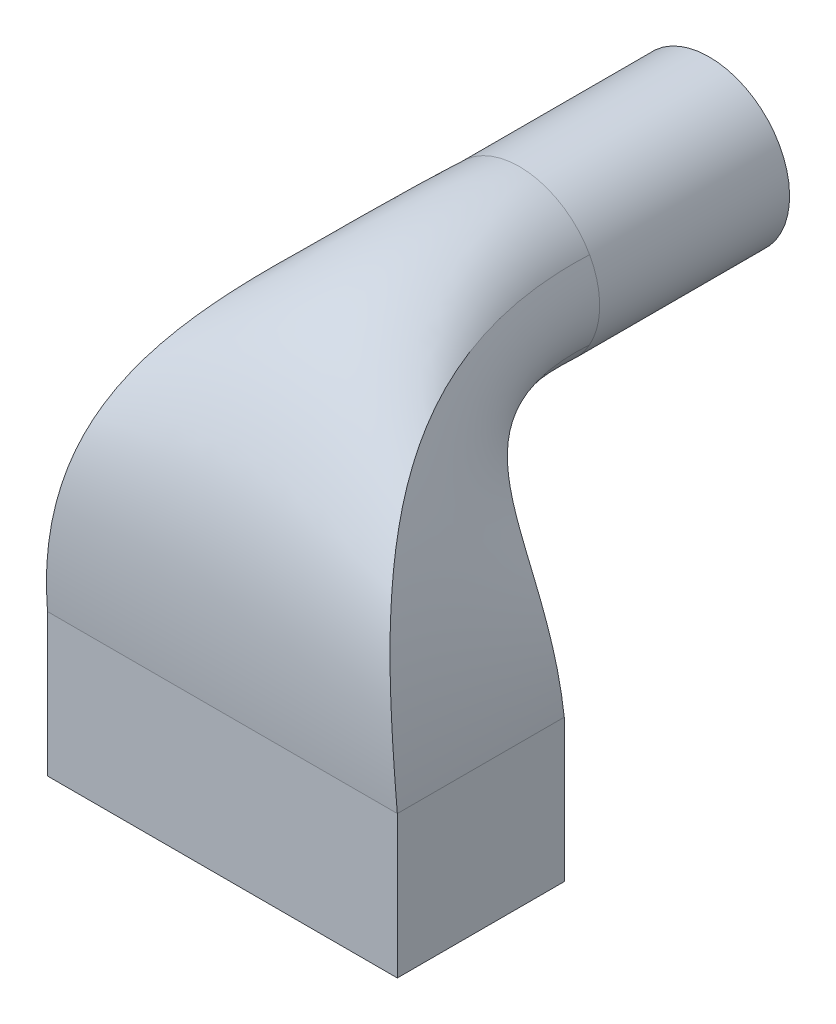
ISO-10303-21;
HEADER;
FILE_DESCRIPTION(('STEP AP214'),'2;1');
FILE_NAME('part.step','',(''),(''),'','','');
FILE_SCHEMA(('AUTOMOTIVE_DESIGN { 1 0 10303 214 1 1 1 1 }'));
ENDSEC;
DATA;
#1=APPLICATION_CONTEXT('core data for automotive mechanical design processes');
#2=APPLICATION_PROTOCOL_DEFINITION('international standard','automotive_design',2000,#1);
#3=PRODUCT_CONTEXT('',#1,'mechanical');
#4=PRODUCT('Part','Part','',(#3));
#5=PRODUCT_RELATED_PRODUCT_CATEGORY('part','',(#4));
#6=PRODUCT_DEFINITION_FORMATION('','',#4);
#7=PRODUCT_DEFINITION_CONTEXT('part definition',#1,'design');
#8=PRODUCT_DEFINITION('design','',#6,#7);
#9=PRODUCT_DEFINITION_SHAPE('','',#8);
#10=(LENGTH_UNIT() NAMED_UNIT(*) SI_UNIT(.MILLI.,.METRE.));
#11=(NAMED_UNIT(*) PLANE_ANGLE_UNIT() SI_UNIT($,.RADIAN.));
#12=(NAMED_UNIT(*) SI_UNIT($,.STERADIAN.) SOLID_ANGLE_UNIT());
#13=UNCERTAINTY_MEASURE_WITH_UNIT(LENGTH_MEASURE(1.E-05),#10,'distance_accuracy_value','');
#14=(GEOMETRIC_REPRESENTATION_CONTEXT(3) GLOBAL_UNCERTAINTY_ASSIGNED_CONTEXT((#13)) GLOBAL_UNIT_ASSIGNED_CONTEXT((#10,
#11,#12)) REPRESENTATION_CONTEXT('',''));
#15=CARTESIAN_POINT('',(0.,0.,0.));
#16=DIRECTION('',(0.,0.,1.));
#17=DIRECTION('',(1.,0.,0.));
#18=AXIS2_PLACEMENT_3D('',#15,#16,#17);
#19=CARTESIAN_POINT('',(0.,0.,0.));
#20=DIRECTION('',(0.,-1.,0.));
#21=DIRECTION('',(0.,0.,-1.));
#22=AXIS2_PLACEMENT_3D('',#19,#20,#21);
#23=PLANE('',#22);
#24=DIRECTION('',(0.,0.,-1.));
#25=VECTOR('',#24,1.);
#26=CARTESIAN_POINT('',(3.68476653354024,0.,1.75820796518656));
#27=LINE('',#26,#25);
#28=CARTESIAN_POINT('',(3.68476653354024,0.,1.75820796518656));
#29=VERTEX_POINT('',#28);
#30=CARTESIAN_POINT('',(3.68476653354023,0.,-1.75820796518656));
#31=VERTEX_POINT('',#30);
#32=EDGE_CURVE('E328',#29,#31,#27,.T.);
#33=ORIENTED_EDGE('',*,*,#32,.F.);
#34=DIRECTION('',(1.,0.,0.));
#35=VECTOR('',#34,1.);
#36=CARTESIAN_POINT('',(-3.68476653354024,0.,1.75820796518656));
#37=LINE('',#36,#35);
#38=CARTESIAN_POINT('',(-3.68476653354024,0.,1.75820796518656));
#39=VERTEX_POINT('',#38);
#40=EDGE_CURVE('E316',#39,#29,#37,.T.);
#41=ORIENTED_EDGE('',*,*,#40,.F.);
#42=DIRECTION('',(0.,0.,1.));
#43=VECTOR('',#42,1.);
#44=CARTESIAN_POINT('',(-3.68476653354024,0.,1.75820796518656));
#45=LINE('',#44,#43);
#46=CARTESIAN_POINT('',(-3.68476653354024,0.,-1.75820796518656));
#47=VERTEX_POINT('',#46);
#48=EDGE_CURVE('E308',#47,#39,#45,.T.);
#49=ORIENTED_EDGE('',*,*,#48,.F.);
#50=DIRECTION('',(-1.,0.,0.));
#51=VECTOR('',#50,1.);
#52=CARTESIAN_POINT('',(-3.68476653354024,0.,-1.75820796518656));
#53=LINE('',#52,#51);
#54=EDGE_CURVE('E317',#31,#47,#53,.T.);
#55=ORIENTED_EDGE('',*,*,#54,.F.);
#56=EDGE_LOOP('',(#33,#41,#49,#55));
#57=FACE_BOUND('',#56,.T.);
#58=DIRECTION('',(1.,0.,0.));
#59=VECTOR('',#58,1.);
#60=CARTESIAN_POINT('',(-3.,0.,1.25));
#61=LINE('',#60,#59);
#62=CARTESIAN_POINT('',(-3.,0.,1.25));
#63=VERTEX_POINT('',#62);
#64=CARTESIAN_POINT('',(3.,0.,1.25));
#65=VERTEX_POINT('',#64);
#66=EDGE_CURVE('E508',#63,#65,#61,.T.);
#67=ORIENTED_EDGE('',*,*,#66,.T.);
#68=DIRECTION('',(0.,0.,-1.));
#69=VECTOR('',#68,1.);
#70=CARTESIAN_POINT('',(3.,0.,1.25));
#71=LINE('',#70,#69);
#72=CARTESIAN_POINT('',(3.,0.,-1.25));
#73=VERTEX_POINT('',#72);
#74=EDGE_CURVE('E238',#65,#73,#71,.T.);
#75=ORIENTED_EDGE('',*,*,#74,.T.);
#76=DIRECTION('',(-1.,0.,0.));
#77=VECTOR('',#76,1.);
#78=CARTESIAN_POINT('',(-3.,0.,-1.25));
#79=LINE('',#78,#77);
#80=CARTESIAN_POINT('',(-3.,0.,-1.25));
#81=VERTEX_POINT('',#80);
#82=EDGE_CURVE('E514',#73,#81,#79,.T.);
#83=ORIENTED_EDGE('',*,*,#82,.T.);
#84=DIRECTION('',(0.,0.,1.));
#85=VECTOR('',#84,1.);
#86=CARTESIAN_POINT('',(-3.,0.,1.25));
#87=LINE('',#86,#85);
#88=EDGE_CURVE('E511',#81,#63,#87,.T.);
#89=ORIENTED_EDGE('',*,*,#88,.T.);
#90=EDGE_LOOP('',(#67,#75,#83,#89));
#91=FACE_BOUND('',#90,.T.);
#92=ADVANCED_FACE('F218',(#57,#91),#23,.T.);
#93=CARTESIAN_POINT('',(3.68476653354024,2.,1.75820796518656));
#94=DIRECTION('',(-1.,0.,0.));
#95=DIRECTION('',(0.,0.,1.));
#96=AXIS2_PLACEMENT_3D('',#93,#94,#95);
#97=PLANE('',#96);
#98=ORIENTED_EDGE('',*,*,#32,.T.);
#99=DIRECTION('',(0.,-1.,0.));
#100=VECTOR('',#99,1.);
#101=CARTESIAN_POINT('',(3.68476653354023,2.,-1.75820796518656));
#102=LINE('',#101,#100);
#103=CARTESIAN_POINT('',(3.68476653354023,3.,-1.75820796518656));
#104=VERTEX_POINT('',#103);
#105=EDGE_CURVE('E13',#104,#31,#102,.T.);
#106=ORIENTED_EDGE('',*,*,#105,.F.);
#107=DIRECTION('',(0.,0.,1.));
#108=VECTOR('',#107,1.);
#109=CARTESIAN_POINT('',(3.68476653354024,3.,1.75820796518656));
#110=LINE('',#109,#108);
#111=CARTESIAN_POINT('',(3.68476653354023,3.,1.75820796518656));
#112=VERTEX_POINT('',#111);
#113=EDGE_CURVE('E259',#112,#104,#110,.F.);
#114=ORIENTED_EDGE('',*,*,#113,.F.);
#115=DIRECTION('',(0.,-1.,0.));
#116=VECTOR('',#115,1.);
#117=CARTESIAN_POINT('',(3.68476653354024,2.,1.75820796518656));
#118=LINE('',#117,#116);
#119=EDGE_CURVE('E323',#112,#29,#118,.T.);
#120=ORIENTED_EDGE('',*,*,#119,.T.);
#121=EDGE_LOOP('',(#98,#106,#114,#120));
#122=FACE_BOUND('',#121,.T.);
#123=ADVANCED_FACE('F220',(#122),#97,.F.);
#124=CARTESIAN_POINT('',(-3.68476653354024,2.,-1.75820796518656));
#125=DIRECTION('',(0.,0.,1.));
#126=DIRECTION('',(1.,0.,0.));
#127=AXIS2_PLACEMENT_3D('',#124,#125,#126);
#128=PLANE('',#127);
#129=ORIENTED_EDGE('',*,*,#54,.T.);
#130=DIRECTION('',(0.,-1.,0.));
#131=VECTOR('',#130,1.);
#132=CARTESIAN_POINT('',(-3.68476653354024,2.,-1.75820796518656));
#133=LINE('',#132,#131);
#134=CARTESIAN_POINT('',(-3.68476653354024,3.,-1.75820796518656));
#135=VERTEX_POINT('',#134);
#136=EDGE_CURVE('E229',#135,#47,#133,.T.);
#137=ORIENTED_EDGE('',*,*,#136,.F.);
#138=DIRECTION('',(1.,0.,0.));
#139=VECTOR('',#138,1.);
#140=CARTESIAN_POINT('',(-3.68476653354024,3.,-1.75820796518656));
#141=LINE('',#140,#139);
#142=EDGE_CURVE('E338',#104,#135,#141,.F.);
#143=ORIENTED_EDGE('',*,*,#142,.F.);
#144=ORIENTED_EDGE('',*,*,#105,.T.);
#145=EDGE_LOOP('',(#129,#137,#143,#144));
#146=FACE_BOUND('',#145,.T.);
#147=ADVANCED_FACE('F496',(#146),#128,.F.);
#148=CARTESIAN_POINT('',(-3.68476653354024,2.,1.75820796518656));
#149=DIRECTION('',(1.,0.,0.));
#150=DIRECTION('',(0.,0.,-1.));
#151=AXIS2_PLACEMENT_3D('',#148,#149,#150);
#152=PLANE('',#151);
#153=ORIENTED_EDGE('',*,*,#48,.T.);
#154=DIRECTION('',(0.,-1.,0.));
#155=VECTOR('',#154,1.);
#156=CARTESIAN_POINT('',(-3.68476653354024,2.,1.75820796518656));
#157=LINE('',#156,#155);
#158=CARTESIAN_POINT('',(-3.68476653354024,3.,1.75820796518656));
#159=VERTEX_POINT('',#158);
#160=EDGE_CURVE('E312',#159,#39,#157,.T.);
#161=ORIENTED_EDGE('',*,*,#160,.F.);
#162=DIRECTION('',(0.,0.,-1.));
#163=VECTOR('',#162,1.);
#164=CARTESIAN_POINT('',(-3.68476653354024,3.,1.75820796518656));
#165=LINE('',#164,#163);
#166=EDGE_CURVE('E335',#135,#159,#165,.F.);
#167=ORIENTED_EDGE('',*,*,#166,.F.);
#168=ORIENTED_EDGE('',*,*,#136,.T.);
#169=EDGE_LOOP('',(#153,#161,#167,#168));
#170=FACE_BOUND('',#169,.T.);
#171=ADVANCED_FACE('F310',(#170),#152,.F.);
#172=CARTESIAN_POINT('',(-3.68476653354024,2.,1.75820796518656));
#173=DIRECTION('',(0.,0.,-1.));
#174=DIRECTION('',(-1.,0.,0.));
#175=AXIS2_PLACEMENT_3D('',#172,#173,#174);
#176=PLANE('',#175);
#177=ORIENTED_EDGE('',*,*,#40,.T.);
#178=ORIENTED_EDGE('',*,*,#119,.F.);
#179=DIRECTION('',(-1.,0.,0.));
#180=VECTOR('',#179,1.);
#181=CARTESIAN_POINT('',(-3.68476653354024,3.,1.75820796518656));
#182=LINE('',#181,#180);
#183=EDGE_CURVE('E322',#159,#112,#182,.F.);
#184=ORIENTED_EDGE('',*,*,#183,.F.);
#185=ORIENTED_EDGE('',*,*,#160,.T.);
#186=EDGE_LOOP('',(#177,#178,#184,#185));
#187=FACE_BOUND('',#186,.T.);
#188=ADVANCED_FACE('F320',(#187),#176,.F.);
#189=CARTESIAN_POINT('',(3.,2.,1.25));
#190=DIRECTION('',(-1.,0.,0.));
#191=DIRECTION('',(0.,0.,1.));
#192=AXIS2_PLACEMENT_3D('',#189,#190,#191);
#193=PLANE('',#192);
#194=ORIENTED_EDGE('',*,*,#74,.F.);
#195=DIRECTION('',(0.,-1.,0.));
#196=VECTOR('',#195,1.);
#197=CARTESIAN_POINT('',(3.,2.,1.25));
#198=LINE('',#197,#196);
#199=CARTESIAN_POINT('',(3.,2.,1.25));
#200=VERTEX_POINT('',#199);
#201=EDGE_CURVE('E505',#200,#65,#198,.T.);
#202=ORIENTED_EDGE('',*,*,#201,.F.);
#203=DIRECTION('',(0.,0.,-1.));
#204=VECTOR('',#203,1.);
#205=CARTESIAN_POINT('',(3.,2.,1.25));
#206=LINE('',#205,#204);
#207=CARTESIAN_POINT('',(3.,2.,-1.25));
#208=VERTEX_POINT('',#207);
#209=EDGE_CURVE('E354',#200,#208,#206,.T.);
#210=ORIENTED_EDGE('',*,*,#209,.T.);
#211=DIRECTION('',(0.,-1.,0.));
#212=VECTOR('',#211,1.);
#213=CARTESIAN_POINT('',(3.,2.,-1.25));
#214=LINE('',#213,#212);
#215=EDGE_CURVE('E497',#208,#73,#214,.T.);
#216=ORIENTED_EDGE('',*,*,#215,.T.);
#217=EDGE_LOOP('',(#194,#202,#210,#216));
#218=FACE_BOUND('',#217,.T.);
#219=ADVANCED_FACE('F528',(#218),#193,.T.);
#220=CARTESIAN_POINT('',(-3.,2.,-1.25));
#221=DIRECTION('',(0.,0.,1.));
#222=DIRECTION('',(1.,0.,0.));
#223=AXIS2_PLACEMENT_3D('',#220,#221,#222);
#224=PLANE('',#223);
#225=ORIENTED_EDGE('',*,*,#82,.F.);
#226=ORIENTED_EDGE('',*,*,#215,.F.);
#227=DIRECTION('',(-1.,0.,0.));
#228=VECTOR('',#227,1.);
#229=CARTESIAN_POINT('',(-3.,2.,-1.25));
#230=LINE('',#229,#228);
#231=CARTESIAN_POINT('',(-3.,2.,-1.25));
#232=VERTEX_POINT('',#231);
#233=EDGE_CURVE('E522',#208,#232,#230,.T.);
#234=ORIENTED_EDGE('',*,*,#233,.T.);
#235=DIRECTION('',(0.,-1.,0.));
#236=VECTOR('',#235,1.);
#237=CARTESIAN_POINT('',(-3.,2.,-1.25));
#238=LINE('',#237,#236);
#239=EDGE_CURVE('E501',#232,#81,#238,.T.);
#240=ORIENTED_EDGE('',*,*,#239,.T.);
#241=EDGE_LOOP('',(#225,#226,#234,#240));
#242=FACE_BOUND('',#241,.T.);
#243=ADVANCED_FACE('F530',(#242),#224,.T.);
#244=CARTESIAN_POINT('',(-3.,2.,1.25));
#245=DIRECTION('',(1.,0.,0.));
#246=DIRECTION('',(0.,0.,-1.));
#247=AXIS2_PLACEMENT_3D('',#244,#245,#246);
#248=PLANE('',#247);
#249=ORIENTED_EDGE('',*,*,#88,.F.);
#250=ORIENTED_EDGE('',*,*,#239,.F.);
#251=DIRECTION('',(0.,0.,1.));
#252=VECTOR('',#251,1.);
#253=CARTESIAN_POINT('',(-3.,2.,1.25));
#254=LINE('',#253,#252);
#255=CARTESIAN_POINT('',(-3.,2.,1.25));
#256=VERTEX_POINT('',#255);
#257=EDGE_CURVE('E520',#232,#256,#254,.T.);
#258=ORIENTED_EDGE('',*,*,#257,.T.);
#259=DIRECTION('',(0.,-1.,0.));
#260=VECTOR('',#259,1.);
#261=CARTESIAN_POINT('',(-3.,2.,1.25));
#262=LINE('',#261,#260);
#263=EDGE_CURVE('E503',#256,#63,#262,.T.);
#264=ORIENTED_EDGE('',*,*,#263,.T.);
#265=EDGE_LOOP('',(#249,#250,#258,#264));
#266=FACE_BOUND('',#265,.T.);
#267=ADVANCED_FACE('F537',(#266),#248,.T.);
#268=CARTESIAN_POINT('',(-3.,2.,1.25));
#269=DIRECTION('',(0.,0.,-1.));
#270=DIRECTION('',(-1.,0.,0.));
#271=AXIS2_PLACEMENT_3D('',#268,#269,#270);
#272=PLANE('',#271);
#273=ORIENTED_EDGE('',*,*,#66,.F.);
#274=ORIENTED_EDGE('',*,*,#263,.F.);
#275=DIRECTION('',(1.,0.,0.));
#276=VECTOR('',#275,1.);
#277=CARTESIAN_POINT('',(-3.,2.,1.25));
#278=LINE('',#277,#276);
#279=EDGE_CURVE('E507',#256,#200,#278,.T.);
#280=ORIENTED_EDGE('',*,*,#279,.T.);
#281=ORIENTED_EDGE('',*,*,#201,.T.);
#282=EDGE_LOOP('',(#273,#274,#280,#281));
#283=FACE_BOUND('',#282,.T.);
#284=ADVANCED_FACE('F535',(#283),#272,.T.);
#285=CARTESIAN_POINT('',(0.,2.,0.));
#286=DIRECTION('',(0.,-1.,0.));
#287=DIRECTION('',(0.,0.,-1.));
#288=AXIS2_PLACEMENT_3D('',#285,#286,#287);
#289=PLANE('',#288);
#290=ORIENTED_EDGE('',*,*,#209,.F.);
#291=ORIENTED_EDGE('',*,*,#279,.F.);
#292=ORIENTED_EDGE('',*,*,#257,.F.);
#293=ORIENTED_EDGE('',*,*,#233,.F.);
#294=EDGE_LOOP('',(#290,#291,#292,#293));
#295=FACE_BOUND('',#294,.T.);
#296=ADVANCED_FACE('F444',(#295),#289,.T.);
#297=CARTESIAN_POINT('',(-3.68476653354023,3.,1.75820796518656));
#298=CARTESIAN_POINT('',(-3.68476653354023,7.65230553078626,2.1385410871906));
#299=CARTESIAN_POINT('',(-1.4782687124674,9.17512147960139,-0.0616391982001206));
#300=CARTESIAN_POINT('',(-1.4782687124674,8.96335169228682,-4.49820796518656));
#301=CARTESIAN_POINT('',(-3.37770265574522,3.,1.75820796518656));
#302=CARTESIAN_POINT('',(-3.37770265574521,7.66406801263598,2.1385410871906));
#303=CARTESIAN_POINT('',(-1.40543950742017,9.30611978851029,-0.0498767163504075));
#304=CARTESIAN_POINT('',(-1.40543950742017,9.09435000119572,-4.49820796518656));
#305=CARTESIAN_POINT('',(-2.76357490015518,3.,1.75820796518656));
#306=CARTESIAN_POINT('',(-2.76357490015518,7.68759297633541,2.1385410871906));
#307=CARTESIAN_POINT('',(-1.22477437141226,9.54864210988134,-0.0263517526509743));
#308=CARTESIAN_POINT('',(-1.22477437141226,9.33687232256677,-4.49820796518656));
#309=CARTESIAN_POINT('',(-1.84238326677012,3.,1.75820796518656));
#310=CARTESIAN_POINT('',(-1.84238326677012,7.72962730749523,2.1385410871906));
#311=CARTESIAN_POINT('',(-0.867679007881916,9.82841851473311,0.0156825785088382));
#312=CARTESIAN_POINT('',(-0.867679007881916,9.61664872741855,-4.49820796518656));
#313=CARTESIAN_POINT('',(-0.921191633385059,3.,1.75820796518656));
#314=CARTESIAN_POINT('',(-0.921191633385058,7.76065809656418,2.1385410871906));
#315=CARTESIAN_POINT('',(-0.449635767285766,10.0045769217381,0.0467133675778018));
#316=CARTESIAN_POINT('',(-0.449635767285765,9.79280713442356,-4.49820796518656));
#317=CARTESIAN_POINT('',(-0.30706387779502,3.,1.75820796518656));
#318=CARTESIAN_POINT('',(-0.307071186260965,7.76701383938595,2.1385410871906));
#319=CARTESIAN_POINT('',(-0.149897092800372,10.0446358654216,0.0530691103995594));
#320=CARTESIAN_POINT('',(-0.149882120497414,9.83286607810707,-4.49820796518656));
#321=CARTESIAN_POINT('',(0.30706387779502,3.,1.75820796518656));
#322=CARTESIAN_POINT('',(0.307071186260966,7.76701383938594,2.1385410871906));
#323=CARTESIAN_POINT('',(0.149897092800371,10.0446358654216,0.0530691103995635));
#324=CARTESIAN_POINT('',(0.149882120497414,9.83286607810707,-4.49820796518656));
#325=CARTESIAN_POINT('',(0.921191633385059,3.,1.75820796518656));
#326=CARTESIAN_POINT('',(0.921191633385059,7.76065809656419,2.1385410871906));
#327=CARTESIAN_POINT('',(0.449635767285763,10.0045769217381,0.0467133675777942));
#328=CARTESIAN_POINT('',(0.449635767285763,9.79280713442356,-4.49820796518657));
#329=CARTESIAN_POINT('',(1.84238326677012,3.,1.75820796518656));
#330=CARTESIAN_POINT('',(1.84238326677012,7.72962730749522,2.1385410871906));
#331=CARTESIAN_POINT('',(0.867679007881919,9.82841851473312,0.0156825785088473));
#332=CARTESIAN_POINT('',(0.867679007881919,9.61664872741856,-4.49820796518655));
#333=CARTESIAN_POINT('',(2.76357490015518,3.,1.75820796518656));
#334=CARTESIAN_POINT('',(2.76357490015518,7.68759297633541,2.1385410871906));
#335=CARTESIAN_POINT('',(1.22477437141226,9.54864210988133,-0.0263517526509754));
#336=CARTESIAN_POINT('',(1.22477437141226,9.33687232256677,-4.49820796518657));
#337=CARTESIAN_POINT('',(3.37770265574522,3.,1.75820796518656));
#338=CARTESIAN_POINT('',(3.37770265574522,7.66406801263598,2.1385410871906));
#339=CARTESIAN_POINT('',(1.40543950742017,9.30611978851029,-0.0498767163504045));
#340=CARTESIAN_POINT('',(1.40543950742017,9.09435000119572,-4.49820796518656));
#341=CARTESIAN_POINT('',(3.68476653354023,3.,1.75820796518656));
#342=CARTESIAN_POINT('',(3.68476653354024,7.65230553078626,2.1385410871906));
#343=CARTESIAN_POINT('',(1.4782687124674,9.17512147960139,-0.0616391982001176));
#344=CARTESIAN_POINT('',(1.4782687124674,8.96335169228683,-4.49820796518656));
#345=B_SPLINE_SURFACE_WITH_KNOTS('',3,3,((#297,#298,#299,#300),(#301,#302,#303,#304),(#305,#306,
#307,#308),(#309,#310,#311,#312),(#313,#314,#315,#316),(#317,#318,#319,#320),(#321,#322,#323,
#324),(#325,#326,#327,#328),(#329,#330,#331,#332),(#333,#334,#335,#336),(#337,#338,#339,#340),
(#341,#342,#343,#344)),.UNSPECIFIED.,.F.,.F.,.F.,(4,1,1,1,2,1,1,1,4),(4,4),(0.661511684980137,
0.703822724357619,0.746133763735102,0.788444803112585,0.830755842490068,0.873066881867551,
0.915377921245034,0.957688960622517,1.),(0.,1.),.UNSPECIFIED.);
#346=CARTESIAN_POINT('',(3.68476653354023,3.,1.75820796518656));
#347=CARTESIAN_POINT('',(3.68476653354024,7.65230553078626,2.1385410871906));
#348=CARTESIAN_POINT('',(1.4782687124674,9.17512147960139,-0.0616391982001176));
#349=CARTESIAN_POINT('',(1.4782687124674,8.96335169228683,-4.49820796518656));
#350=B_SPLINE_CURVE_WITH_KNOTS('',3,(#346,#347,#348,#349),.UNSPECIFIED.,.F.,.F.,(4,4),(0.,1.),.UNSPECIFIED.);
#351=CARTESIAN_POINT('',(1.4783749578988,8.96341042162051,-4.49820796518656));
#352=VERTEX_POINT('',#351);
#353=EDGE_CURVE('E346',#112,#352,#350,.T.);
#354=CARTESIAN_POINT('',(0.,8.14150035640385,-4.49820796518656));
#355=DIRECTION('',(0.,0.,-1.));
#356=DIRECTION('',(-1.,0.,0.));
#357=AXIS2_PLACEMENT_3D('',#354,#355,#356);
#358=CIRCLE('',#357,1.69136572170322);
#359=CARTESIAN_POINT('',(-1.47835209282406,8.96339773567149,-4.49820796518656));
#360=VERTEX_POINT('',#359);
#361=EDGE_CURVE('E270',#360,#352,#358,.T.);
#362=CARTESIAN_POINT('',(-3.68476653354023,3.,1.75820796518656));
#363=CARTESIAN_POINT('',(-3.68476653354023,7.65230553078626,2.1385410871906));
#364=CARTESIAN_POINT('',(-1.4782687124674,9.17512147960139,-0.0616391982001206));
#365=CARTESIAN_POINT('',(-1.4782687124674,8.96335169228682,-4.49820796518656));
#366=B_SPLINE_CURVE_WITH_KNOTS('',3,(#362,#363,#364,#365),.UNSPECIFIED.,.F.,.F.,(4,4),(0.,1.),.UNSPECIFIED.);
#367=EDGE_CURVE('E478',#159,#360,#366,.T.);
#368=ORIENTED_EDGE('',*,*,#183,.T.);
#369=ORIENTED_EDGE('',*,*,#353,.T.);
#370=ORIENTED_EDGE('',*,*,#361,.F.);
#371=ORIENTED_EDGE('',*,*,#367,.F.);
#372=EDGE_LOOP('',(#368,#369,#370,#371));
#373=FACE_BOUND('',#372,.T.);
#374=ADVANCED_FACE('F432',(#373),#345,.T.);
#375=CARTESIAN_POINT('',(-3.68476653354023,3.,-1.75820796518656));
#376=CARTESIAN_POINT('',(-3.68476653354023,6.53583688659971,-1.37787484318252));
#377=CARTESIAN_POINT('',(-1.4782687124674,7.53141880783544,-1.17810784238667));
#378=CARTESIAN_POINT('',(-1.4782687124674,7.31964902052087,-4.49820796518656));
#379=CARTESIAN_POINT('',(-3.68476653354023,3.,-1.46517330432213));
#380=CARTESIAN_POINT('',(-3.68476653354023,6.61264476469132,-1.08484018231809));
#381=CARTESIAN_POINT('',(-1.54777047726508,7.65643203087935,-1.10129996429506));
#382=CARTESIAN_POINT('',(-1.54777047726508,7.44466224356479,-4.49820796518656));
#383=CARTESIAN_POINT('',(-3.68476653354024,3.,-0.879103982593281));
#384=CARTESIAN_POINT('',(-3.68476653354024,6.76626052087454,-0.498770860589238));
#385=CARTESIAN_POINT('',(-1.65489952507054,7.92416973985762,-0.947684208111848));
#386=CARTESIAN_POINT('',(-1.65489952507054,7.71239995254306,-4.49820796518656));
#387=CARTESIAN_POINT('',(-3.68476653354023,3.,0.));
#388=CARTESIAN_POINT('',(-3.68476653354023,7.04842388584998,0.380333122004041));
#389=CARTESIAN_POINT('',(-1.70961146681709,8.35327014371842,-0.6655208431364));
#390=CARTESIAN_POINT('',(-1.70961146681709,8.14150035640385,-4.49820796518656));
#391=CARTESIAN_POINT('',(-3.68476653354024,3.,0.879103982593279));
#392=CARTESIAN_POINT('',(-3.68476653354024,7.34585513689896,1.25943710459732));
#393=CARTESIAN_POINT('',(-1.65489952507054,8.78237054757921,-0.368089592087426));
#394=CARTESIAN_POINT('',(-1.65489952507054,8.57060076026464,-4.49820796518656));
#395=CARTESIAN_POINT('',(-3.68476653354023,3.,1.46517330432213));
#396=CARTESIAN_POINT('',(-3.68476653354023,7.5501553994905,1.84550642632617));
#397=CARTESIAN_POINT('',(-1.54777047726508,9.05010825655748,-0.163789329495891));
#398=CARTESIAN_POINT('',(-1.54777047726508,8.83833846924291,-4.49820796518656));
#399=CARTESIAN_POINT('',(-3.68476653354023,3.,1.75820796518656));
#400=CARTESIAN_POINT('',(-3.68476653354023,7.65230553078626,2.1385410871906));
#401=CARTESIAN_POINT('',(-1.4782687124674,9.17512147960139,-0.0616391982001206));
#402=CARTESIAN_POINT('',(-1.4782687124674,8.96335169228682,-4.49820796518656));
#403=B_SPLINE_SURFACE_WITH_KNOTS('',3,3,((#375,#376,#377,#378),(#379,#380,#381,#382),(#383,#384,
#385,#386),(#387,#388,#389,#390),(#391,#392,#393,#394),(#395,#396,#397,#398),(#399,#400,#401,
#402)),.UNSPECIFIED.,.F.,.F.,.F.,(4,1,1,1,4),(4,4),(0.5,0.540377921245034,0.580755842490068,
0.621133763735102,0.661511684980137),(0.,1.),.UNSPECIFIED.);
#404=CARTESIAN_POINT('',(-1.47837495797758,7.31959029114364,-4.49820796518656));
#405=VERTEX_POINT('',#404);
#406=EDGE_CURVE('E342',#405,#360,#358,.T.);
#407=CARTESIAN_POINT('',(-3.68476653354023,3.,-1.75820796518656));
#408=CARTESIAN_POINT('',(-3.68476653354023,6.53583688659971,-1.37787484318252));
#409=CARTESIAN_POINT('',(-1.4782687124674,7.53141880783544,-1.17810784238667));
#410=CARTESIAN_POINT('',(-1.4782687124674,7.31964902052087,-4.49820796518656));
#411=B_SPLINE_CURVE_WITH_KNOTS('',3,(#407,#408,#409,#410),.UNSPECIFIED.,.F.,.F.,(4,4),(0.,1.),.UNSPECIFIED.);
#412=EDGE_CURVE('E468',#135,#405,#411,.T.);
#413=ORIENTED_EDGE('',*,*,#166,.T.);
#414=ORIENTED_EDGE('',*,*,#367,.T.);
#415=ORIENTED_EDGE('',*,*,#406,.F.);
#416=ORIENTED_EDGE('',*,*,#412,.F.);
#417=EDGE_LOOP('',(#413,#414,#415,#416));
#418=FACE_BOUND('',#417,.T.);
#419=ADVANCED_FACE('F421',(#418),#403,.T.);
#420=CARTESIAN_POINT('',(3.68476653354023,3.,-1.75820796518656));
#421=CARTESIAN_POINT('',(3.68476653354024,6.53583688659971,-1.37787484318252));
#422=CARTESIAN_POINT('',(1.4782687124674,7.53141880783544,-1.17810784238667));
#423=CARTESIAN_POINT('',(1.4782687124674,7.31964902052087,-4.49820796518656));
#424=CARTESIAN_POINT('',(3.0706387779502,3.,-1.75820796518656));
#425=CARTESIAN_POINT('',(3.0706387779502,6.42452134383925,-1.37787484318252));
#426=CARTESIAN_POINT('',(1.33261030242003,7.26942219010234,-1.28942338514713));
#427=CARTESIAN_POINT('',(1.33261030242003,7.05765240278777,-4.49820796518656));
#428=CARTESIAN_POINT('',(1.84238326677012,3.,-1.75820796518656));
#429=CARTESIAN_POINT('',(1.84238326677012,6.20189025831834,-1.37787484318251));
#430=CARTESIAN_POINT('',(0.899106161043149,6.82487121008936,-1.51205447066805));
#431=CARTESIAN_POINT('',(0.899106161043149,6.6131014227748,-4.49820796518656));
#432=CARTESIAN_POINT('',(0.,3.,-1.75820796518656));
#433=CARTESIAN_POINT('',(0.,6.12015045594249,-1.37787484318252));
#434=CARTESIAN_POINT('',(0.,6.58012608376584,-1.59379427304389));
#435=CARTESIAN_POINT('',(0.,6.36835629645128,-4.49820796518656));
#436=CARTESIAN_POINT('',(-1.84238326677012,3.,-1.75820796518656));
#437=CARTESIAN_POINT('',(-1.84238326677012,6.20189025831834,-1.37787484318252));
#438=CARTESIAN_POINT('',(-0.899106161043148,6.82487121008935,-1.51205447066804));
#439=CARTESIAN_POINT('',(-0.899106161043148,6.61310142277479,-4.49820796518655));
#440=CARTESIAN_POINT('',(-3.0706387779502,3.,-1.75820796518656));
#441=CARTESIAN_POINT('',(-3.0706387779502,6.42452134383925,-1.37787484318252));
#442=CARTESIAN_POINT('',(-1.33261030242003,7.26942219010234,-1.28942338514713));
#443=CARTESIAN_POINT('',(-1.33261030242003,7.05765240278777,-4.49820796518656));
#444=CARTESIAN_POINT('',(-3.68476653354023,3.,-1.75820796518656));
#445=CARTESIAN_POINT('',(-3.68476653354023,6.53583688659971,-1.37787484318252));
#446=CARTESIAN_POINT('',(-1.4782687124674,7.53141880783544,-1.17810784238667));
#447=CARTESIAN_POINT('',(-1.4782687124674,7.31964902052087,-4.49820796518656));
#448=B_SPLINE_SURFACE_WITH_KNOTS('',3,3,((#420,#421,#422,#423),(#424,#425,#426,#427),(#428,#429,
#430,#431),(#432,#433,#434,#435),(#436,#437,#438,#439),(#440,#441,#442,#443),(#444,#445,#446,
#447)),.UNSPECIFIED.,.F.,.F.,.F.,(4,1,1,1,4),(4,4),(0.161511684980137,0.246133763735103,
0.330755842490068,0.415377921245034,0.5),(0.,1.),.UNSPECIFIED.);
#449=CARTESIAN_POINT('',(1.47835209290962,7.31960297708896,-4.49820796518656));
#450=VERTEX_POINT('',#449);
#451=EDGE_CURVE('E345',#450,#405,#358,.T.);
#452=CARTESIAN_POINT('',(3.68476653354023,3.,-1.75820796518656));
#453=CARTESIAN_POINT('',(3.68476653354024,6.53583688659971,-1.37787484318252));
#454=CARTESIAN_POINT('',(1.4782687124674,7.53141880783544,-1.17810784238667));
#455=CARTESIAN_POINT('',(1.4782687124674,7.31964902052087,-4.49820796518656));
#456=B_SPLINE_CURVE_WITH_KNOTS('',3,(#452,#453,#454,#455),.UNSPECIFIED.,.F.,.F.,(4,4),(0.,1.),.UNSPECIFIED.);
#457=EDGE_CURVE('E463',#104,#450,#456,.T.);
#458=ORIENTED_EDGE('',*,*,#142,.T.);
#459=ORIENTED_EDGE('',*,*,#412,.T.);
#460=ORIENTED_EDGE('',*,*,#451,.F.);
#461=ORIENTED_EDGE('',*,*,#457,.F.);
#462=EDGE_LOOP('',(#458,#459,#460,#461));
#463=FACE_BOUND('',#462,.T.);
#464=ADVANCED_FACE('F395',(#463),#448,.T.);
#465=CARTESIAN_POINT('',(3.68476653354023,3.,1.75820796518656));
#466=CARTESIAN_POINT('',(3.68476653354024,7.65230553078626,2.1385410871906));
#467=CARTESIAN_POINT('',(1.4782687124674,9.17512147960139,-0.0616391982001176));
#468=CARTESIAN_POINT('',(1.4782687124674,8.96335169228683,-4.49820796518656));
#469=CARTESIAN_POINT('',(3.68476653354024,3.,1.46517330432213));
#470=CARTESIAN_POINT('',(3.68476653354024,7.55015539949049,1.84550642632617));
#471=CARTESIAN_POINT('',(1.54777047726508,9.05010825655748,-0.163789329495888));
#472=CARTESIAN_POINT('',(1.54777047726508,8.83833846924291,-4.49820796518656));
#473=CARTESIAN_POINT('',(3.68476653354024,3.,0.879103982593279));
#474=CARTESIAN_POINT('',(3.68476653354024,7.34585513689896,1.25943710459732));
#475=CARTESIAN_POINT('',(1.65489952507054,8.78237054757921,-0.368089592087429));
#476=CARTESIAN_POINT('',(1.65489952507054,8.57060076026465,-4.49820796518656));
#477=CARTESIAN_POINT('',(3.68476653354023,3.,0.));
#478=CARTESIAN_POINT('',(3.68476653354023,7.04842388584998,0.380333122004043));
#479=CARTESIAN_POINT('',(1.70961146681709,8.35327014371841,-0.665520843136395));
#480=CARTESIAN_POINT('',(1.70961146681709,8.14150035640384,-4.49820796518655));
#481=CARTESIAN_POINT('',(3.68476653354024,3.,-0.879103982593279));
#482=CARTESIAN_POINT('',(3.68476653354024,6.76626052087455,-0.498770860589237));
#483=CARTESIAN_POINT('',(1.65489952507054,7.92416973985764,-0.94768420811185));
#484=CARTESIAN_POINT('',(1.65489952507054,7.71239995254307,-4.49820796518657));
#485=CARTESIAN_POINT('',(3.68476653354024,3.,-1.46517330432213));
#486=CARTESIAN_POINT('',(3.68476653354024,6.61264476469132,-1.08484018231809));
#487=CARTESIAN_POINT('',(1.54777047726508,7.65643203087935,-1.10129996429506));
#488=CARTESIAN_POINT('',(1.54777047726508,7.44466224356479,-4.49820796518656));
#489=CARTESIAN_POINT('',(3.68476653354023,3.,-1.75820796518656));
#490=CARTESIAN_POINT('',(3.68476653354024,6.53583688659971,-1.37787484318252));
#491=CARTESIAN_POINT('',(1.4782687124674,7.53141880783544,-1.17810784238667));
#492=CARTESIAN_POINT('',(1.4782687124674,7.31964902052087,-4.49820796518656));
#493=B_SPLINE_SURFACE_WITH_KNOTS('',3,3,((#465,#466,#467,#468),(#469,#470,#471,#472),(#473,#474,
#475,#476),(#477,#478,#479,#480),(#481,#482,#483,#484),(#485,#486,#487,#488),(#489,#490,#491,
#492)),.UNSPECIFIED.,.F.,.F.,.F.,(4,1,1,1,4),(4,4),(0.,0.0403779212450342,0.0807558424900683,
0.121133763735102,0.161511684980137),(0.,1.),.UNSPECIFIED.);
#494=EDGE_CURVE('E222',#352,#450,#358,.T.);
#495=ORIENTED_EDGE('',*,*,#113,.T.);
#496=ORIENTED_EDGE('',*,*,#457,.T.);
#497=ORIENTED_EDGE('',*,*,#494,.F.);
#498=ORIENTED_EDGE('',*,*,#353,.F.);
#499=EDGE_LOOP('',(#495,#496,#497,#498));
#500=FACE_BOUND('',#499,.T.);
#501=ADVANCED_FACE('F389',(#500),#493,.T.);
#502=CARTESIAN_POINT('',(0.,8.14150035640385,-8.49820796518656));
#503=DIRECTION('',(0.,0.,1.));
#504=DIRECTION('',(1.,0.,0.));
#505=AXIS2_PLACEMENT_3D('',#502,#503,#504);
#506=CYLINDRICAL_SURFACE('',#505,1.69136572170322);
#507=CARTESIAN_POINT('',(0.,8.14150035640385,-8.49820796518656));
#508=DIRECTION('',(0.,0.,-1.));
#509=DIRECTION('',(-1.,0.,0.));
#510=AXIS2_PLACEMENT_3D('',#507,#508,#509);
#511=CIRCLE('',#510,1.69136572170322);
#512=CARTESIAN_POINT('',(-1.69136572170322,8.14150035640385,-8.49820796518656));
#513=VERTEX_POINT('',#512);
#514=EDGE_CURVE('E469',#513,#513,#511,.T.);
#515=ORIENTED_EDGE('',*,*,#514,.F.);
#516=EDGE_LOOP('',(#515));
#517=FACE_BOUND('',#516,.T.);
#518=ORIENTED_EDGE('',*,*,#361,.T.);
#519=ORIENTED_EDGE('',*,*,#494,.T.);
#520=ORIENTED_EDGE('',*,*,#451,.T.);
#521=ORIENTED_EDGE('',*,*,#406,.T.);
#522=EDGE_LOOP('',(#518,#519,#520,#521));
#523=FACE_BOUND('',#522,.T.);
#524=ADVANCED_FACE('F365',(#517,#523),#506,.T.);
#525=CARTESIAN_POINT('',(0.,8.14150035640385,-8.49820796518656));
#526=DIRECTION('',(0.,0.,-1.));
#527=DIRECTION('',(-1.,0.,0.));
#528=AXIS2_PLACEMENT_3D('',#525,#526,#527);
#529=PLANE('',#528);
#530=ORIENTED_EDGE('',*,*,#514,.T.);
#531=EDGE_LOOP('',(#530));
#532=FACE_BOUND('',#531,.T.);
#533=ADVANCED_FACE('F388',(#532),#529,.T.);
#534=CLOSED_SHELL('',(#92,#123,#147,#171,#188,#219,#243,#267,#284,#296,#374,#419,#464,#501,#524,#533));
#535=MANIFOLD_SOLID_BREP('B2',#534);
#536=ADVANCED_BREP_SHAPE_REPRESENTATION('',(#18,#535),#14);
#537=SHAPE_DEFINITION_REPRESENTATION(#9,#536);
ENDSEC;
END-ISO-10303-21;
